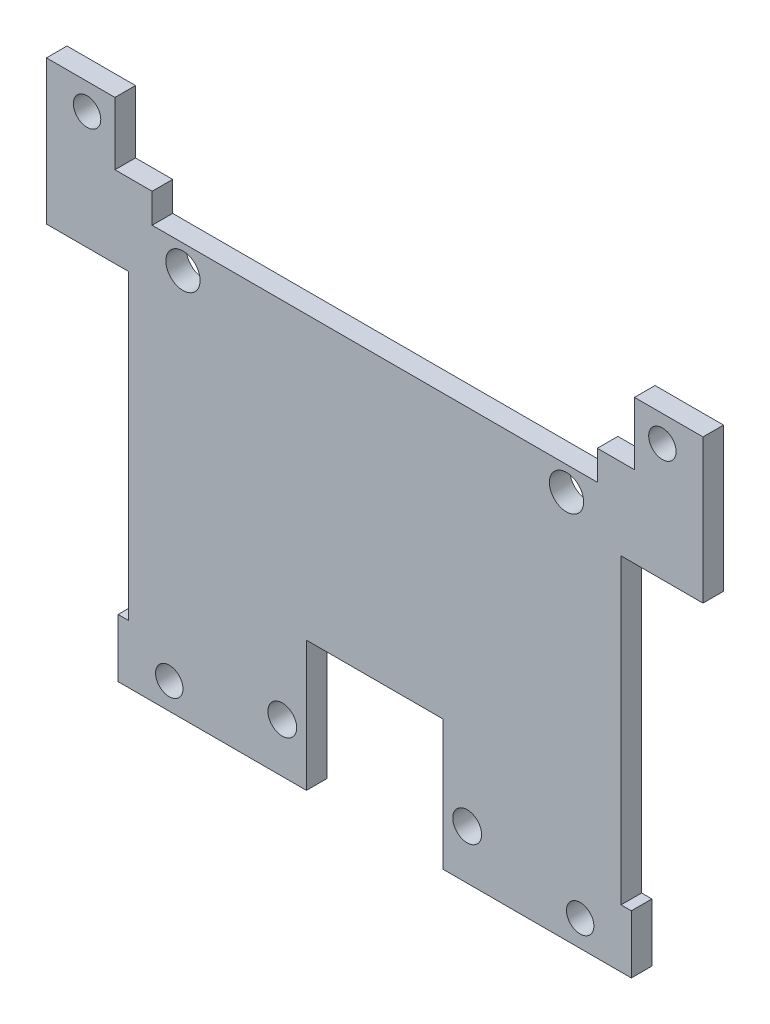
ISO-10303-21;
HEADER;
FILE_DESCRIPTION(('STEP AP214'),'2;1');
FILE_NAME('part.step','',(''),(''),'','','');
FILE_SCHEMA(('AUTOMOTIVE_DESIGN { 1 0 10303 214 1 1 1 1 }'));
ENDSEC;
DATA;
#1=APPLICATION_CONTEXT('core data for automotive mechanical design processes');
#2=APPLICATION_PROTOCOL_DEFINITION('international standard','automotive_design',2000,#1);
#3=PRODUCT_CONTEXT('',#1,'mechanical');
#4=PRODUCT('Part','Part','',(#3));
#5=PRODUCT_RELATED_PRODUCT_CATEGORY('part','',(#4));
#6=PRODUCT_DEFINITION_FORMATION('','',#4);
#7=PRODUCT_DEFINITION_CONTEXT('part definition',#1,'design');
#8=PRODUCT_DEFINITION('design','',#6,#7);
#9=PRODUCT_DEFINITION_SHAPE('','',#8);
#10=(LENGTH_UNIT() NAMED_UNIT(*) SI_UNIT(.MILLI.,.METRE.));
#11=(NAMED_UNIT(*) PLANE_ANGLE_UNIT() SI_UNIT($,.RADIAN.));
#12=(NAMED_UNIT(*) SI_UNIT($,.STERADIAN.) SOLID_ANGLE_UNIT());
#13=UNCERTAINTY_MEASURE_WITH_UNIT(LENGTH_MEASURE(1.E-05),#10,'distance_accuracy_value','');
#14=(GEOMETRIC_REPRESENTATION_CONTEXT(3) GLOBAL_UNCERTAINTY_ASSIGNED_CONTEXT((#13)) GLOBAL_UNIT_ASSIGNED_CONTEXT((#10,
#11,#12)) REPRESENTATION_CONTEXT('',''));
#15=CARTESIAN_POINT('',(0.,0.,0.));
#16=DIRECTION('',(0.,0.,1.));
#17=DIRECTION('',(1.,0.,0.));
#18=AXIS2_PLACEMENT_3D('',#15,#16,#17);
#19=CARTESIAN_POINT('',(-32.5,23.375,3.));
#20=DIRECTION('',(-1.,0.,0.));
#21=DIRECTION('',(0.,0.,1.));
#22=AXIS2_PLACEMENT_3D('',#19,#20,#21);
#23=PLANE('',#22);
#24=DIRECTION('',(0.,1.,0.));
#25=VECTOR('',#24,1.);
#26=CARTESIAN_POINT('',(-32.5,23.375,0.));
#27=LINE('',#26,#25);
#28=CARTESIAN_POINT('',(-32.5,23.375,0.));
#29=VERTEX_POINT('',#28);
#30=CARTESIAN_POINT('',(-32.5,27.675,0.));
#31=VERTEX_POINT('',#30);
#32=EDGE_CURVE('E229',#29,#31,#27,.T.);
#33=ORIENTED_EDGE('',*,*,#32,.T.);
#34=DIRECTION('',(0.,0.,-1.));
#35=VECTOR('',#34,1.);
#36=CARTESIAN_POINT('',(-32.5,27.675,3.));
#37=LINE('',#36,#35);
#38=CARTESIAN_POINT('',(-32.5,27.675,3.));
#39=VERTEX_POINT('',#38);
#40=EDGE_CURVE('E11',#39,#31,#37,.T.);
#41=ORIENTED_EDGE('',*,*,#40,.F.);
#42=DIRECTION('',(0.,1.,0.));
#43=VECTOR('',#42,1.);
#44=CARTESIAN_POINT('',(-32.5,23.375,3.));
#45=LINE('',#44,#43);
#46=CARTESIAN_POINT('',(-32.5,23.375,3.));
#47=VERTEX_POINT('',#46);
#48=EDGE_CURVE('E276',#47,#39,#45,.T.);
#49=ORIENTED_EDGE('',*,*,#48,.F.);
#50=DIRECTION('',(0.,0.,-1.));
#51=VECTOR('',#50,1.);
#52=CARTESIAN_POINT('',(-32.5,23.375,3.));
#53=LINE('',#52,#51);
#54=EDGE_CURVE('E225',#47,#29,#53,.T.);
#55=ORIENTED_EDGE('',*,*,#54,.T.);
#56=EDGE_LOOP('',(#33,#41,#49,#55));
#57=FACE_BOUND('',#56,.T.);
#58=ADVANCED_FACE('F35',(#57),#23,.F.);
#59=CARTESIAN_POINT('',(-32.5,27.675,3.));
#60=DIRECTION('',(0.,-1.,0.));
#61=DIRECTION('',(0.,0.,-1.));
#62=AXIS2_PLACEMENT_3D('',#59,#60,#61);
#63=PLANE('',#62);
#64=DIRECTION('',(-1.,0.,0.));
#65=VECTOR('',#64,1.);
#66=CARTESIAN_POINT('',(-32.5,27.675,0.));
#67=LINE('',#66,#65);
#68=CARTESIAN_POINT('',(-37.93,27.675,0.));
#69=VERTEX_POINT('',#68);
#70=EDGE_CURVE('E232',#31,#69,#67,.T.);
#71=ORIENTED_EDGE('',*,*,#70,.T.);
#72=DIRECTION('',(0.,0.,-1.));
#73=VECTOR('',#72,1.);
#74=CARTESIAN_POINT('',(-37.93,27.675,3.));
#75=LINE('',#74,#73);
#76=CARTESIAN_POINT('',(-37.93,27.675,3.));
#77=VERTEX_POINT('',#76);
#78=EDGE_CURVE('E44',#77,#69,#75,.T.);
#79=ORIENTED_EDGE('',*,*,#78,.F.);
#80=DIRECTION('',(-1.,0.,0.));
#81=VECTOR('',#80,1.);
#82=CARTESIAN_POINT('',(-32.5,27.675,3.));
#83=LINE('',#82,#81);
#84=EDGE_CURVE('E144',#39,#77,#83,.T.);
#85=ORIENTED_EDGE('',*,*,#84,.F.);
#86=ORIENTED_EDGE('',*,*,#40,.T.);
#87=EDGE_LOOP('',(#71,#79,#85,#86));
#88=FACE_BOUND('',#87,.T.);
#89=ADVANCED_FACE('F447',(#88),#63,.F.);
#90=CARTESIAN_POINT('',(-37.93,27.675,3.));
#91=DIRECTION('',(-1.,0.,0.));
#92=DIRECTION('',(0.,0.,1.));
#93=AXIS2_PLACEMENT_3D('',#90,#91,#92);
#94=PLANE('',#93);
#95=DIRECTION('',(0.,1.,0.));
#96=VECTOR('',#95,1.);
#97=CARTESIAN_POINT('',(-37.93,27.675,0.));
#98=LINE('',#97,#96);
#99=CARTESIAN_POINT('',(-37.93,36.825,0.));
#100=VERTEX_POINT('',#99);
#101=EDGE_CURVE('E235',#69,#100,#98,.T.);
#102=ORIENTED_EDGE('',*,*,#101,.T.);
#103=DIRECTION('',(0.,0.,-1.));
#104=VECTOR('',#103,1.);
#105=CARTESIAN_POINT('',(-37.93,36.825,3.));
#106=LINE('',#105,#104);
#107=CARTESIAN_POINT('',(-37.93,36.825,3.));
#108=VERTEX_POINT('',#107);
#109=EDGE_CURVE('E331',#108,#100,#106,.T.);
#110=ORIENTED_EDGE('',*,*,#109,.F.);
#111=DIRECTION('',(0.,1.,0.));
#112=VECTOR('',#111,1.);
#113=CARTESIAN_POINT('',(-37.93,27.675,3.));
#114=LINE('',#113,#112);
#115=EDGE_CURVE('E383',#77,#108,#114,.T.);
#116=ORIENTED_EDGE('',*,*,#115,.F.);
#117=ORIENTED_EDGE('',*,*,#78,.T.);
#118=EDGE_LOOP('',(#102,#110,#116,#117));
#119=FACE_BOUND('',#118,.T.);
#120=ADVANCED_FACE('F451',(#119),#94,.F.);
#121=CARTESIAN_POINT('',(-37.93,36.825,3.));
#122=DIRECTION('',(0.,-1.,0.));
#123=DIRECTION('',(0.,0.,-1.));
#124=AXIS2_PLACEMENT_3D('',#121,#122,#123);
#125=PLANE('',#124);
#126=DIRECTION('',(-1.,0.,0.));
#127=VECTOR('',#126,1.);
#128=CARTESIAN_POINT('',(-37.93,36.825,0.));
#129=LINE('',#128,#127);
#130=CARTESIAN_POINT('',(-47.93,36.825,0.));
#131=VERTEX_POINT('',#130);
#132=EDGE_CURVE('E237',#100,#131,#129,.T.);
#133=ORIENTED_EDGE('',*,*,#132,.T.);
#134=DIRECTION('',(0.,0.,-1.));
#135=VECTOR('',#134,1.);
#136=CARTESIAN_POINT('',(-47.93,36.825,3.));
#137=LINE('',#136,#135);
#138=CARTESIAN_POINT('',(-47.93,36.825,3.));
#139=VERTEX_POINT('',#138);
#140=EDGE_CURVE('E328',#139,#131,#137,.T.);
#141=ORIENTED_EDGE('',*,*,#140,.F.);
#142=DIRECTION('',(-1.,0.,0.));
#143=VECTOR('',#142,1.);
#144=CARTESIAN_POINT('',(-37.93,36.825,3.));
#145=LINE('',#144,#143);
#146=EDGE_CURVE('E385',#108,#139,#145,.T.);
#147=ORIENTED_EDGE('',*,*,#146,.F.);
#148=ORIENTED_EDGE('',*,*,#109,.T.);
#149=EDGE_LOOP('',(#133,#141,#147,#148));
#150=FACE_BOUND('',#149,.T.);
#151=ADVANCED_FACE('F455',(#150),#125,.F.);
#152=CARTESIAN_POINT('',(-47.93,36.825,3.));
#153=DIRECTION('',(1.,0.,0.));
#154=DIRECTION('',(0.,1.,0.));
#155=AXIS2_PLACEMENT_3D('',#152,#153,#154);
#156=PLANE('',#155);
#157=DIRECTION('',(0.,-1.,0.));
#158=VECTOR('',#157,1.);
#159=CARTESIAN_POINT('',(-47.93,36.825,0.));
#160=LINE('',#159,#158);
#161=CARTESIAN_POINT('',(-47.93,15.805,0.));
#162=VERTEX_POINT('',#161);
#163=EDGE_CURVE('E239',#131,#162,#160,.T.);
#164=ORIENTED_EDGE('',*,*,#163,.T.);
#165=DIRECTION('',(0.,0.,-1.));
#166=VECTOR('',#165,1.);
#167=CARTESIAN_POINT('',(-47.93,15.805,3.));
#168=LINE('',#167,#166);
#169=CARTESIAN_POINT('',(-47.93,15.805,3.));
#170=VERTEX_POINT('',#169);
#171=EDGE_CURVE('E325',#170,#162,#168,.T.);
#172=ORIENTED_EDGE('',*,*,#171,.F.);
#173=DIRECTION('',(0.,-1.,0.));
#174=VECTOR('',#173,1.);
#175=CARTESIAN_POINT('',(-47.93,36.825,3.));
#176=LINE('',#175,#174);
#177=EDGE_CURVE('E387',#139,#170,#176,.T.);
#178=ORIENTED_EDGE('',*,*,#177,.F.);
#179=ORIENTED_EDGE('',*,*,#140,.T.);
#180=EDGE_LOOP('',(#164,#172,#178,#179));
#181=FACE_BOUND('',#180,.T.);
#182=ADVANCED_FACE('F461',(#181),#156,.F.);
#183=CARTESIAN_POINT('',(-47.93,15.805,3.));
#184=DIRECTION('',(0.,1.,0.));
#185=DIRECTION('',(-1.,0.,0.));
#186=AXIS2_PLACEMENT_3D('',#183,#184,#185);
#187=PLANE('',#186);
#188=DIRECTION('',(1.,0.,0.));
#189=VECTOR('',#188,1.);
#190=CARTESIAN_POINT('',(-47.93,15.805,0.));
#191=LINE('',#190,#189);
#192=CARTESIAN_POINT('',(-35.97,15.805,0.));
#193=VERTEX_POINT('',#192);
#194=EDGE_CURVE('E241',#162,#193,#191,.T.);
#195=ORIENTED_EDGE('',*,*,#194,.T.);
#196=DIRECTION('',(0.,0.,-1.));
#197=VECTOR('',#196,1.);
#198=CARTESIAN_POINT('',(-35.97,15.805,3.));
#199=LINE('',#198,#197);
#200=CARTESIAN_POINT('',(-35.97,15.805,3.));
#201=VERTEX_POINT('',#200);
#202=EDGE_CURVE('E322',#201,#193,#199,.T.);
#203=ORIENTED_EDGE('',*,*,#202,.F.);
#204=DIRECTION('',(1.,0.,0.));
#205=VECTOR('',#204,1.);
#206=CARTESIAN_POINT('',(-47.93,15.805,3.));
#207=LINE('',#206,#205);
#208=EDGE_CURVE('E389',#170,#201,#207,.T.);
#209=ORIENTED_EDGE('',*,*,#208,.F.);
#210=ORIENTED_EDGE('',*,*,#171,.T.);
#211=EDGE_LOOP('',(#195,#203,#209,#210));
#212=FACE_BOUND('',#211,.T.);
#213=ADVANCED_FACE('F465',(#212),#187,.F.);
#214=CARTESIAN_POINT('',(-35.97,15.805,3.));
#215=DIRECTION('',(1.,0.,0.));
#216=DIRECTION('',(0.,1.,0.));
#217=AXIS2_PLACEMENT_3D('',#214,#215,#216);
#218=PLANE('',#217);
#219=DIRECTION('',(0.,-1.,0.));
#220=VECTOR('',#219,1.);
#221=CARTESIAN_POINT('',(-35.97,15.805,0.));
#222=LINE('',#221,#220);
#223=CARTESIAN_POINT('',(-35.97,-28.325,0.));
#224=VERTEX_POINT('',#223);
#225=EDGE_CURVE('E243',#193,#224,#222,.T.);
#226=ORIENTED_EDGE('',*,*,#225,.T.);
#227=DIRECTION('',(0.,0.,-1.));
#228=VECTOR('',#227,1.);
#229=CARTESIAN_POINT('',(-35.97,-28.325,3.));
#230=LINE('',#229,#228);
#231=CARTESIAN_POINT('',(-35.97,-28.325,3.));
#232=VERTEX_POINT('',#231);
#233=EDGE_CURVE('E319',#232,#224,#230,.T.);
#234=ORIENTED_EDGE('',*,*,#233,.F.);
#235=DIRECTION('',(0.,-1.,0.));
#236=VECTOR('',#235,1.);
#237=CARTESIAN_POINT('',(-35.97,15.805,3.));
#238=LINE('',#237,#236);
#239=EDGE_CURVE('E391',#201,#232,#238,.T.);
#240=ORIENTED_EDGE('',*,*,#239,.F.);
#241=ORIENTED_EDGE('',*,*,#202,.T.);
#242=EDGE_LOOP('',(#226,#234,#240,#241));
#243=FACE_BOUND('',#242,.T.);
#244=ADVANCED_FACE('F469',(#243),#218,.F.);
#245=CARTESIAN_POINT('',(-35.97,-28.325,3.));
#246=DIRECTION('',(0.,-1.,0.));
#247=DIRECTION('',(1.,0.,0.));
#248=AXIS2_PLACEMENT_3D('',#245,#246,#247);
#249=PLANE('',#248);
#250=DIRECTION('',(-1.,0.,0.));
#251=VECTOR('',#250,1.);
#252=CARTESIAN_POINT('',(-35.97,-28.325,0.));
#253=LINE('',#252,#251);
#254=CARTESIAN_POINT('',(-37.47,-28.325,0.));
#255=VERTEX_POINT('',#254);
#256=EDGE_CURVE('E245',#224,#255,#253,.T.);
#257=ORIENTED_EDGE('',*,*,#256,.T.);
#258=DIRECTION('',(0.,0.,-1.));
#259=VECTOR('',#258,1.);
#260=CARTESIAN_POINT('',(-37.47,-28.325,3.));
#261=LINE('',#260,#259);
#262=CARTESIAN_POINT('',(-37.47,-28.325,3.));
#263=VERTEX_POINT('',#262);
#264=EDGE_CURVE('E316',#263,#255,#261,.T.);
#265=ORIENTED_EDGE('',*,*,#264,.F.);
#266=DIRECTION('',(-1.,0.,0.));
#267=VECTOR('',#266,1.);
#268=CARTESIAN_POINT('',(-35.97,-28.325,3.));
#269=LINE('',#268,#267);
#270=EDGE_CURVE('E393',#232,#263,#269,.T.);
#271=ORIENTED_EDGE('',*,*,#270,.F.);
#272=ORIENTED_EDGE('',*,*,#233,.T.);
#273=EDGE_LOOP('',(#257,#265,#271,#272));
#274=FACE_BOUND('',#273,.T.);
#275=ADVANCED_FACE('F473',(#274),#249,.F.);
#276=CARTESIAN_POINT('',(-37.47,-28.325,3.));
#277=DIRECTION('',(1.,0.,0.));
#278=DIRECTION('',(0.,0.,-1.));
#279=AXIS2_PLACEMENT_3D('',#276,#277,#278);
#280=PLANE('',#279);
#281=DIRECTION('',(0.,-1.,0.));
#282=VECTOR('',#281,1.);
#283=CARTESIAN_POINT('',(-37.47,-28.325,0.));
#284=LINE('',#283,#282);
#285=CARTESIAN_POINT('',(-37.47,-36.825,0.));
#286=VERTEX_POINT('',#285);
#287=EDGE_CURVE('E247',#255,#286,#284,.T.);
#288=ORIENTED_EDGE('',*,*,#287,.T.);
#289=DIRECTION('',(0.,0.,-1.));
#290=VECTOR('',#289,1.);
#291=CARTESIAN_POINT('',(-37.47,-36.825,3.));
#292=LINE('',#291,#290);
#293=CARTESIAN_POINT('',(-37.47,-36.825,3.));
#294=VERTEX_POINT('',#293);
#295=EDGE_CURVE('E313',#294,#286,#292,.T.);
#296=ORIENTED_EDGE('',*,*,#295,.F.);
#297=DIRECTION('',(0.,-1.,0.));
#298=VECTOR('',#297,1.);
#299=CARTESIAN_POINT('',(-37.47,-28.325,3.));
#300=LINE('',#299,#298);
#301=EDGE_CURVE('E395',#263,#294,#300,.T.);
#302=ORIENTED_EDGE('',*,*,#301,.F.);
#303=ORIENTED_EDGE('',*,*,#264,.T.);
#304=EDGE_LOOP('',(#288,#296,#302,#303));
#305=FACE_BOUND('',#304,.T.);
#306=ADVANCED_FACE('F477',(#305),#280,.F.);
#307=CARTESIAN_POINT('',(-37.47,-36.825,3.));
#308=DIRECTION('',(0.,1.,0.));
#309=DIRECTION('',(-1.,0.,0.));
#310=AXIS2_PLACEMENT_3D('',#307,#308,#309);
#311=PLANE('',#310);
#312=DIRECTION('',(1.,0.,0.));
#313=VECTOR('',#312,1.);
#314=CARTESIAN_POINT('',(-37.47,-36.825,0.));
#315=LINE('',#314,#313);
#316=CARTESIAN_POINT('',(-9.97,-36.825,0.));
#317=VERTEX_POINT('',#316);
#318=EDGE_CURVE('E249',#286,#317,#315,.T.);
#319=ORIENTED_EDGE('',*,*,#318,.T.);
#320=DIRECTION('',(0.,0.,-1.));
#321=VECTOR('',#320,1.);
#322=CARTESIAN_POINT('',(-9.97,-36.825,3.));
#323=LINE('',#322,#321);
#324=CARTESIAN_POINT('',(-9.97,-36.825,3.));
#325=VERTEX_POINT('',#324);
#326=EDGE_CURVE('E310',#325,#317,#323,.T.);
#327=ORIENTED_EDGE('',*,*,#326,.F.);
#328=DIRECTION('',(1.,0.,0.));
#329=VECTOR('',#328,1.);
#330=CARTESIAN_POINT('',(-37.47,-36.825,3.));
#331=LINE('',#330,#329);
#332=EDGE_CURVE('E397',#294,#325,#331,.T.);
#333=ORIENTED_EDGE('',*,*,#332,.F.);
#334=ORIENTED_EDGE('',*,*,#295,.T.);
#335=EDGE_LOOP('',(#319,#327,#333,#334));
#336=FACE_BOUND('',#335,.T.);
#337=ADVANCED_FACE('F481',(#336),#311,.F.);
#338=CARTESIAN_POINT('',(-9.97,-36.825,3.));
#339=DIRECTION('',(-1.,0.,0.));
#340=DIRECTION('',(0.,0.,1.));
#341=AXIS2_PLACEMENT_3D('',#338,#339,#340);
#342=PLANE('',#341);
#343=DIRECTION('',(0.,1.,0.));
#344=VECTOR('',#343,1.);
#345=CARTESIAN_POINT('',(-9.97,-36.825,0.));
#346=LINE('',#345,#344);
#347=CARTESIAN_POINT('',(-9.97,-17.825,0.));
#348=VERTEX_POINT('',#347);
#349=EDGE_CURVE('E251',#317,#348,#346,.T.);
#350=ORIENTED_EDGE('',*,*,#349,.T.);
#351=DIRECTION('',(0.,0.,-1.));
#352=VECTOR('',#351,1.);
#353=CARTESIAN_POINT('',(-9.97,-17.825,3.));
#354=LINE('',#353,#352);
#355=CARTESIAN_POINT('',(-9.97,-17.825,3.));
#356=VERTEX_POINT('',#355);
#357=EDGE_CURVE('E307',#356,#348,#354,.T.);
#358=ORIENTED_EDGE('',*,*,#357,.F.);
#359=DIRECTION('',(0.,1.,0.));
#360=VECTOR('',#359,1.);
#361=CARTESIAN_POINT('',(-9.97,-36.825,3.));
#362=LINE('',#361,#360);
#363=EDGE_CURVE('E399',#325,#356,#362,.T.);
#364=ORIENTED_EDGE('',*,*,#363,.F.);
#365=ORIENTED_EDGE('',*,*,#326,.T.);
#366=EDGE_LOOP('',(#350,#358,#364,#365));
#367=FACE_BOUND('',#366,.T.);
#368=ADVANCED_FACE('F485',(#367),#342,.F.);
#369=CARTESIAN_POINT('',(-9.97,-17.825,3.));
#370=DIRECTION('',(0.,1.,0.));
#371=DIRECTION('',(-1.,0.,0.));
#372=AXIS2_PLACEMENT_3D('',#369,#370,#371);
#373=PLANE('',#372);
#374=DIRECTION('',(1.,0.,0.));
#375=VECTOR('',#374,1.);
#376=CARTESIAN_POINT('',(-9.97,-17.825,0.));
#377=LINE('',#376,#375);
#378=CARTESIAN_POINT('',(9.97,-17.825,0.));
#379=VERTEX_POINT('',#378);
#380=EDGE_CURVE('E253',#348,#379,#377,.T.);
#381=ORIENTED_EDGE('',*,*,#380,.T.);
#382=DIRECTION('',(0.,0.,-1.));
#383=VECTOR('',#382,1.);
#384=CARTESIAN_POINT('',(9.97,-17.825,3.));
#385=LINE('',#384,#383);
#386=CARTESIAN_POINT('',(9.97,-17.825,3.));
#387=VERTEX_POINT('',#386);
#388=EDGE_CURVE('E304',#387,#379,#385,.T.);
#389=ORIENTED_EDGE('',*,*,#388,.F.);
#390=DIRECTION('',(1.,0.,0.));
#391=VECTOR('',#390,1.);
#392=CARTESIAN_POINT('',(-9.97,-17.825,3.));
#393=LINE('',#392,#391);
#394=EDGE_CURVE('E401',#356,#387,#393,.T.);
#395=ORIENTED_EDGE('',*,*,#394,.F.);
#396=ORIENTED_EDGE('',*,*,#357,.T.);
#397=EDGE_LOOP('',(#381,#389,#395,#396));
#398=FACE_BOUND('',#397,.T.);
#399=ADVANCED_FACE('F489',(#398),#373,.F.);
#400=CARTESIAN_POINT('',(9.97000000000001,-36.825,3.));
#401=DIRECTION('',(1.,0.,0.));
#402=DIRECTION('',(0.,1.,0.));
#403=AXIS2_PLACEMENT_3D('',#400,#401,#402);
#404=PLANE('',#403);
#405=DIRECTION('',(0.,-1.,0.));
#406=VECTOR('',#405,1.);
#407=CARTESIAN_POINT('',(9.97000000000001,-36.825,0.));
#408=LINE('',#407,#406);
#409=CARTESIAN_POINT('',(9.97000000000001,-36.825,0.));
#410=VERTEX_POINT('',#409);
#411=EDGE_CURVE('E255',#379,#410,#408,.T.);
#412=ORIENTED_EDGE('',*,*,#411,.T.);
#413=DIRECTION('',(0.,0.,-1.));
#414=VECTOR('',#413,1.);
#415=CARTESIAN_POINT('',(9.97000000000001,-36.825,3.));
#416=LINE('',#415,#414);
#417=CARTESIAN_POINT('',(9.97000000000001,-36.825,3.));
#418=VERTEX_POINT('',#417);
#419=EDGE_CURVE('E301',#418,#410,#416,.T.);
#420=ORIENTED_EDGE('',*,*,#419,.F.);
#421=DIRECTION('',(0.,-1.,0.));
#422=VECTOR('',#421,1.);
#423=CARTESIAN_POINT('',(9.97000000000001,-36.825,3.));
#424=LINE('',#423,#422);
#425=EDGE_CURVE('E403',#387,#418,#424,.T.);
#426=ORIENTED_EDGE('',*,*,#425,.F.);
#427=ORIENTED_EDGE('',*,*,#388,.T.);
#428=EDGE_LOOP('',(#412,#420,#426,#427));
#429=FACE_BOUND('',#428,.T.);
#430=ADVANCED_FACE('F493',(#429),#404,.F.);
#431=CARTESIAN_POINT('',(37.47,-36.825,3.));
#432=DIRECTION('',(0.,1.,0.));
#433=DIRECTION('',(0.,0.,1.));
#434=AXIS2_PLACEMENT_3D('',#431,#432,#433);
#435=PLANE('',#434);
#436=DIRECTION('',(1.,0.,0.));
#437=VECTOR('',#436,1.);
#438=CARTESIAN_POINT('',(37.47,-36.825,0.));
#439=LINE('',#438,#437);
#440=CARTESIAN_POINT('',(37.47,-36.825,0.));
#441=VERTEX_POINT('',#440);
#442=EDGE_CURVE('E257',#410,#441,#439,.T.);
#443=ORIENTED_EDGE('',*,*,#442,.T.);
#444=DIRECTION('',(0.,0.,-1.));
#445=VECTOR('',#444,1.);
#446=CARTESIAN_POINT('',(37.47,-36.825,3.));
#447=LINE('',#446,#445);
#448=CARTESIAN_POINT('',(37.47,-36.825,3.));
#449=VERTEX_POINT('',#448);
#450=EDGE_CURVE('E298',#449,#441,#447,.T.);
#451=ORIENTED_EDGE('',*,*,#450,.F.);
#452=DIRECTION('',(1.,0.,0.));
#453=VECTOR('',#452,1.);
#454=CARTESIAN_POINT('',(37.47,-36.825,3.));
#455=LINE('',#454,#453);
#456=EDGE_CURVE('E405',#418,#449,#455,.T.);
#457=ORIENTED_EDGE('',*,*,#456,.F.);
#458=ORIENTED_EDGE('',*,*,#419,.T.);
#459=EDGE_LOOP('',(#443,#451,#457,#458));
#460=FACE_BOUND('',#459,.T.);
#461=ADVANCED_FACE('F497',(#460),#435,.F.);
#462=CARTESIAN_POINT('',(37.47,-28.325,3.));
#463=DIRECTION('',(-1.,0.,0.));
#464=DIRECTION('',(0.,-1.,0.));
#465=AXIS2_PLACEMENT_3D('',#462,#463,#464);
#466=PLANE('',#465);
#467=DIRECTION('',(0.,1.,0.));
#468=VECTOR('',#467,1.);
#469=CARTESIAN_POINT('',(37.47,-28.325,0.));
#470=LINE('',#469,#468);
#471=CARTESIAN_POINT('',(37.47,-28.325,0.));
#472=VERTEX_POINT('',#471);
#473=EDGE_CURVE('E259',#441,#472,#470,.T.);
#474=ORIENTED_EDGE('',*,*,#473,.T.);
#475=DIRECTION('',(0.,0.,-1.));
#476=VECTOR('',#475,1.);
#477=CARTESIAN_POINT('',(37.47,-28.325,3.));
#478=LINE('',#477,#476);
#479=CARTESIAN_POINT('',(37.47,-28.325,3.));
#480=VERTEX_POINT('',#479);
#481=EDGE_CURVE('E295',#480,#472,#478,.T.);
#482=ORIENTED_EDGE('',*,*,#481,.F.);
#483=DIRECTION('',(0.,1.,0.));
#484=VECTOR('',#483,1.);
#485=CARTESIAN_POINT('',(37.47,-28.325,3.));
#486=LINE('',#485,#484);
#487=EDGE_CURVE('E407',#449,#480,#486,.T.);
#488=ORIENTED_EDGE('',*,*,#487,.F.);
#489=ORIENTED_EDGE('',*,*,#450,.T.);
#490=EDGE_LOOP('',(#474,#482,#488,#489));
#491=FACE_BOUND('',#490,.T.);
#492=ADVANCED_FACE('F501',(#491),#466,.F.);
#493=CARTESIAN_POINT('',(35.97,-28.325,3.));
#494=DIRECTION('',(0.,-1.,0.));
#495=DIRECTION('',(1.,0.,0.));
#496=AXIS2_PLACEMENT_3D('',#493,#494,#495);
#497=PLANE('',#496);
#498=DIRECTION('',(-1.,0.,0.));
#499=VECTOR('',#498,1.);
#500=CARTESIAN_POINT('',(35.97,-28.325,0.));
#501=LINE('',#500,#499);
#502=CARTESIAN_POINT('',(35.97,-28.325,0.));
#503=VERTEX_POINT('',#502);
#504=EDGE_CURVE('E261',#472,#503,#501,.T.);
#505=ORIENTED_EDGE('',*,*,#504,.T.);
#506=DIRECTION('',(0.,0.,-1.));
#507=VECTOR('',#506,1.);
#508=CARTESIAN_POINT('',(35.97,-28.325,3.));
#509=LINE('',#508,#507);
#510=CARTESIAN_POINT('',(35.97,-28.325,3.));
#511=VERTEX_POINT('',#510);
#512=EDGE_CURVE('E292',#511,#503,#509,.T.);
#513=ORIENTED_EDGE('',*,*,#512,.F.);
#514=DIRECTION('',(-1.,0.,0.));
#515=VECTOR('',#514,1.);
#516=CARTESIAN_POINT('',(35.97,-28.325,3.));
#517=LINE('',#516,#515);
#518=EDGE_CURVE('E409',#480,#511,#517,.T.);
#519=ORIENTED_EDGE('',*,*,#518,.F.);
#520=ORIENTED_EDGE('',*,*,#481,.T.);
#521=EDGE_LOOP('',(#505,#513,#519,#520));
#522=FACE_BOUND('',#521,.T.);
#523=ADVANCED_FACE('F505',(#522),#497,.F.);
#524=CARTESIAN_POINT('',(35.97,15.805,3.));
#525=DIRECTION('',(-1.,0.,0.));
#526=DIRECTION('',(0.,-1.,0.));
#527=AXIS2_PLACEMENT_3D('',#524,#525,#526);
#528=PLANE('',#527);
#529=DIRECTION('',(0.,1.,0.));
#530=VECTOR('',#529,1.);
#531=CARTESIAN_POINT('',(35.97,15.805,0.));
#532=LINE('',#531,#530);
#533=CARTESIAN_POINT('',(35.97,15.805,0.));
#534=VERTEX_POINT('',#533);
#535=EDGE_CURVE('E263',#503,#534,#532,.T.);
#536=ORIENTED_EDGE('',*,*,#535,.T.);
#537=DIRECTION('',(0.,0.,-1.));
#538=VECTOR('',#537,1.);
#539=CARTESIAN_POINT('',(35.97,15.805,3.));
#540=LINE('',#539,#538);
#541=CARTESIAN_POINT('',(35.97,15.805,3.));
#542=VERTEX_POINT('',#541);
#543=EDGE_CURVE('E289',#542,#534,#540,.T.);
#544=ORIENTED_EDGE('',*,*,#543,.F.);
#545=DIRECTION('',(0.,1.,0.));
#546=VECTOR('',#545,1.);
#547=CARTESIAN_POINT('',(35.97,15.805,3.));
#548=LINE('',#547,#546);
#549=EDGE_CURVE('E411',#511,#542,#548,.T.);
#550=ORIENTED_EDGE('',*,*,#549,.F.);
#551=ORIENTED_EDGE('',*,*,#512,.T.);
#552=EDGE_LOOP('',(#536,#544,#550,#551));
#553=FACE_BOUND('',#552,.T.);
#554=ADVANCED_FACE('F509',(#553),#528,.F.);
#555=CARTESIAN_POINT('',(47.93,15.805,3.));
#556=DIRECTION('',(0.,1.,0.));
#557=DIRECTION('',(-1.,0.,0.));
#558=AXIS2_PLACEMENT_3D('',#555,#556,#557);
#559=PLANE('',#558);
#560=DIRECTION('',(1.,0.,0.));
#561=VECTOR('',#560,1.);
#562=CARTESIAN_POINT('',(47.93,15.805,0.));
#563=LINE('',#562,#561);
#564=CARTESIAN_POINT('',(47.93,15.805,0.));
#565=VERTEX_POINT('',#564);
#566=EDGE_CURVE('E265',#534,#565,#563,.T.);
#567=ORIENTED_EDGE('',*,*,#566,.T.);
#568=DIRECTION('',(0.,0.,-1.));
#569=VECTOR('',#568,1.);
#570=CARTESIAN_POINT('',(47.93,15.805,3.));
#571=LINE('',#570,#569);
#572=CARTESIAN_POINT('',(47.93,15.805,3.));
#573=VERTEX_POINT('',#572);
#574=EDGE_CURVE('E286',#573,#565,#571,.T.);
#575=ORIENTED_EDGE('',*,*,#574,.F.);
#576=DIRECTION('',(1.,0.,0.));
#577=VECTOR('',#576,1.);
#578=CARTESIAN_POINT('',(47.93,15.805,3.));
#579=LINE('',#578,#577);
#580=EDGE_CURVE('E413',#542,#573,#579,.T.);
#581=ORIENTED_EDGE('',*,*,#580,.F.);
#582=ORIENTED_EDGE('',*,*,#543,.T.);
#583=EDGE_LOOP('',(#567,#575,#581,#582));
#584=FACE_BOUND('',#583,.T.);
#585=ADVANCED_FACE('F513',(#584),#559,.F.);
#586=CARTESIAN_POINT('',(47.93,36.825,3.));
#587=DIRECTION('',(-1.,0.,0.));
#588=DIRECTION('',(0.,-1.,0.));
#589=AXIS2_PLACEMENT_3D('',#586,#587,#588);
#590=PLANE('',#589);
#591=DIRECTION('',(0.,1.,0.));
#592=VECTOR('',#591,1.);
#593=CARTESIAN_POINT('',(47.93,36.825,0.));
#594=LINE('',#593,#592);
#595=CARTESIAN_POINT('',(47.93,36.825,0.));
#596=VERTEX_POINT('',#595);
#597=EDGE_CURVE('E267',#565,#596,#594,.T.);
#598=ORIENTED_EDGE('',*,*,#597,.T.);
#599=DIRECTION('',(0.,0.,-1.));
#600=VECTOR('',#599,1.);
#601=CARTESIAN_POINT('',(47.93,36.825,3.));
#602=LINE('',#601,#600);
#603=CARTESIAN_POINT('',(47.93,36.825,3.));
#604=VERTEX_POINT('',#603);
#605=EDGE_CURVE('E283',#604,#596,#602,.T.);
#606=ORIENTED_EDGE('',*,*,#605,.F.);
#607=DIRECTION('',(0.,1.,0.));
#608=VECTOR('',#607,1.);
#609=CARTESIAN_POINT('',(47.93,36.825,3.));
#610=LINE('',#609,#608);
#611=EDGE_CURVE('E415',#573,#604,#610,.T.);
#612=ORIENTED_EDGE('',*,*,#611,.F.);
#613=ORIENTED_EDGE('',*,*,#574,.T.);
#614=EDGE_LOOP('',(#598,#606,#612,#613));
#615=FACE_BOUND('',#614,.T.);
#616=ADVANCED_FACE('F517',(#615),#590,.F.);
#617=CARTESIAN_POINT('',(37.93,36.825,3.));
#618=DIRECTION('',(0.,-1.,0.));
#619=DIRECTION('',(1.,0.,0.));
#620=AXIS2_PLACEMENT_3D('',#617,#618,#619);
#621=PLANE('',#620);
#622=DIRECTION('',(-1.,0.,0.));
#623=VECTOR('',#622,1.);
#624=CARTESIAN_POINT('',(37.93,36.825,0.));
#625=LINE('',#624,#623);
#626=CARTESIAN_POINT('',(37.93,36.825,0.));
#627=VERTEX_POINT('',#626);
#628=EDGE_CURVE('E269',#596,#627,#625,.T.);
#629=ORIENTED_EDGE('',*,*,#628,.T.);
#630=DIRECTION('',(0.,0.,-1.));
#631=VECTOR('',#630,1.);
#632=CARTESIAN_POINT('',(37.93,36.825,3.));
#633=LINE('',#632,#631);
#634=CARTESIAN_POINT('',(37.93,36.825,3.));
#635=VERTEX_POINT('',#634);
#636=EDGE_CURVE('E280',#635,#627,#633,.T.);
#637=ORIENTED_EDGE('',*,*,#636,.F.);
#638=DIRECTION('',(-1.,0.,0.));
#639=VECTOR('',#638,1.);
#640=CARTESIAN_POINT('',(37.93,36.825,3.));
#641=LINE('',#640,#639);
#642=EDGE_CURVE('E417',#604,#635,#641,.T.);
#643=ORIENTED_EDGE('',*,*,#642,.F.);
#644=ORIENTED_EDGE('',*,*,#605,.T.);
#645=EDGE_LOOP('',(#629,#637,#643,#644));
#646=FACE_BOUND('',#645,.T.);
#647=ADVANCED_FACE('F423',(#646),#621,.F.);
#648=CARTESIAN_POINT('',(37.93,27.675,3.));
#649=DIRECTION('',(1.,0.,0.));
#650=DIRECTION('',(0.,1.,0.));
#651=AXIS2_PLACEMENT_3D('',#648,#649,#650);
#652=PLANE('',#651);
#653=DIRECTION('',(0.,-1.,0.));
#654=VECTOR('',#653,1.);
#655=CARTESIAN_POINT('',(37.93,27.675,0.));
#656=LINE('',#655,#654);
#657=CARTESIAN_POINT('',(37.93,27.675,0.));
#658=VERTEX_POINT('',#657);
#659=EDGE_CURVE('E271',#627,#658,#656,.T.);
#660=ORIENTED_EDGE('',*,*,#659,.T.);
#661=DIRECTION('',(0.,0.,-1.));
#662=VECTOR('',#661,1.);
#663=CARTESIAN_POINT('',(37.93,27.675,3.));
#664=LINE('',#663,#662);
#665=CARTESIAN_POINT('',(37.93,27.675,3.));
#666=VERTEX_POINT('',#665);
#667=EDGE_CURVE('E220',#666,#658,#664,.T.);
#668=ORIENTED_EDGE('',*,*,#667,.F.);
#669=DIRECTION('',(0.,-1.,0.));
#670=VECTOR('',#669,1.);
#671=CARTESIAN_POINT('',(37.93,27.675,3.));
#672=LINE('',#671,#670);
#673=EDGE_CURVE('E211',#635,#666,#672,.T.);
#674=ORIENTED_EDGE('',*,*,#673,.F.);
#675=ORIENTED_EDGE('',*,*,#636,.T.);
#676=EDGE_LOOP('',(#660,#668,#674,#675));
#677=FACE_BOUND('',#676,.T.);
#678=ADVANCED_FACE('F427',(#677),#652,.F.);
#679=CARTESIAN_POINT('',(32.5,27.675,3.));
#680=DIRECTION('',(0.,-1.,0.));
#681=DIRECTION('',(1.,0.,0.));
#682=AXIS2_PLACEMENT_3D('',#679,#680,#681);
#683=PLANE('',#682);
#684=DIRECTION('',(-1.,0.,0.));
#685=VECTOR('',#684,1.);
#686=CARTESIAN_POINT('',(32.5,27.675,0.));
#687=LINE('',#686,#685);
#688=CARTESIAN_POINT('',(32.5,27.675,0.));
#689=VERTEX_POINT('',#688);
#690=EDGE_CURVE('E219',#658,#689,#687,.T.);
#691=ORIENTED_EDGE('',*,*,#690,.T.);
#692=DIRECTION('',(0.,0.,-1.));
#693=VECTOR('',#692,1.);
#694=CARTESIAN_POINT('',(32.5,27.675,3.));
#695=LINE('',#694,#693);
#696=CARTESIAN_POINT('',(32.5,27.675,3.));
#697=VERTEX_POINT('',#696);
#698=EDGE_CURVE('E216',#697,#689,#695,.T.);
#699=ORIENTED_EDGE('',*,*,#698,.F.);
#700=DIRECTION('',(-1.,0.,0.));
#701=VECTOR('',#700,1.);
#702=CARTESIAN_POINT('',(32.5,27.675,3.));
#703=LINE('',#702,#701);
#704=EDGE_CURVE('E205',#666,#697,#703,.T.);
#705=ORIENTED_EDGE('',*,*,#704,.F.);
#706=ORIENTED_EDGE('',*,*,#667,.T.);
#707=EDGE_LOOP('',(#691,#699,#705,#706));
#708=FACE_BOUND('',#707,.T.);
#709=ADVANCED_FACE('F217',(#708),#683,.F.);
#710=CARTESIAN_POINT('',(32.5,23.375,3.));
#711=DIRECTION('',(1.,0.,0.));
#712=DIRECTION('',(0.,0.,-1.));
#713=AXIS2_PLACEMENT_3D('',#710,#711,#712);
#714=PLANE('',#713);
#715=DIRECTION('',(0.,-1.,0.));
#716=VECTOR('',#715,1.);
#717=CARTESIAN_POINT('',(32.5,23.375,0.));
#718=LINE('',#717,#716);
#719=CARTESIAN_POINT('',(32.5,23.375,0.));
#720=VERTEX_POINT('',#719);
#721=EDGE_CURVE('E130',#689,#720,#718,.T.);
#722=ORIENTED_EDGE('',*,*,#721,.T.);
#723=DIRECTION('',(0.,0.,-1.));
#724=VECTOR('',#723,1.);
#725=CARTESIAN_POINT('',(32.5,23.375,3.));
#726=LINE('',#725,#724);
#727=CARTESIAN_POINT('',(32.5,23.375,3.));
#728=VERTEX_POINT('',#727);
#729=EDGE_CURVE('E221',#728,#720,#726,.T.);
#730=ORIENTED_EDGE('',*,*,#729,.F.);
#731=DIRECTION('',(0.,-1.,0.));
#732=VECTOR('',#731,1.);
#733=CARTESIAN_POINT('',(32.5,23.375,3.));
#734=LINE('',#733,#732);
#735=EDGE_CURVE('E209',#697,#728,#734,.T.);
#736=ORIENTED_EDGE('',*,*,#735,.F.);
#737=ORIENTED_EDGE('',*,*,#698,.T.);
#738=EDGE_LOOP('',(#722,#730,#736,#737));
#739=FACE_BOUND('',#738,.T.);
#740=ADVANCED_FACE('F223',(#739),#714,.F.);
#741=CARTESIAN_POINT('',(32.5,23.375,3.));
#742=DIRECTION('',(0.,-1.,0.));
#743=DIRECTION('',(1.,0.,0.));
#744=AXIS2_PLACEMENT_3D('',#741,#742,#743);
#745=PLANE('',#744);
#746=DIRECTION('',(-1.,0.,0.));
#747=VECTOR('',#746,1.);
#748=CARTESIAN_POINT('',(32.5,23.375,0.));
#749=LINE('',#748,#747);
#750=EDGE_CURVE('E136',#720,#29,#749,.T.);
#751=ORIENTED_EDGE('',*,*,#750,.T.);
#752=ORIENTED_EDGE('',*,*,#54,.F.);
#753=DIRECTION('',(-1.,0.,0.));
#754=VECTOR('',#753,1.);
#755=CARTESIAN_POINT('',(32.5,23.375,3.));
#756=LINE('',#755,#754);
#757=EDGE_CURVE('E53',#728,#47,#756,.T.);
#758=ORIENTED_EDGE('',*,*,#757,.F.);
#759=ORIENTED_EDGE('',*,*,#729,.T.);
#760=EDGE_LOOP('',(#751,#752,#758,#759));
#761=FACE_BOUND('',#760,.T.);
#762=ADVANCED_FACE('F435',(#761),#745,.F.);
#763=CARTESIAN_POINT('',(0.,0.,3.));
#764=DIRECTION('',(0.,0.,1.));
#765=DIRECTION('',(1.,0.,0.));
#766=AXIS2_PLACEMENT_3D('',#763,#764,#765);
#767=PLANE('',#766);
#768=CARTESIAN_POINT('',(-30.,-33.,3.));
#769=DIRECTION('',(0.,0.,1.));
#770=DIRECTION('',(1.,0.,0.));
#771=AXIS2_PLACEMENT_3D('',#768,#769,#770);
#772=CIRCLE('',#771,2.);
#773=CARTESIAN_POINT('',(-28.,-33.,3.));
#774=VERTEX_POINT('',#773);
#775=EDGE_CURVE('E344',#774,#774,#772,.T.);
#776=ORIENTED_EDGE('',*,*,#775,.F.);
#777=EDGE_LOOP('',(#776));
#778=FACE_BOUND('',#777,.T.);
#779=CARTESIAN_POINT('',(30.,-33.,3.));
#780=DIRECTION('',(0.,0.,1.));
#781=DIRECTION('',(-1.,0.,0.));
#782=AXIS2_PLACEMENT_3D('',#779,#780,#781);
#783=CIRCLE('',#782,2.);
#784=CARTESIAN_POINT('',(28.,-33.,3.));
#785=VERTEX_POINT('',#784);
#786=EDGE_CURVE('E638',#785,#785,#783,.T.);
#787=ORIENTED_EDGE('',*,*,#786,.F.);
#788=EDGE_LOOP('',(#787));
#789=FACE_BOUND('',#788,.T.);
#790=CARTESIAN_POINT('',(42.,33.,3.));
#791=DIRECTION('',(0.,0.,1.));
#792=DIRECTION('',(-1.,0.,0.));
#793=AXIS2_PLACEMENT_3D('',#790,#791,#792);
#794=CIRCLE('',#793,2.);
#795=CARTESIAN_POINT('',(40.,33.,3.));
#796=VERTEX_POINT('',#795);
#797=EDGE_CURVE('E357',#796,#796,#794,.T.);
#798=ORIENTED_EDGE('',*,*,#797,.F.);
#799=EDGE_LOOP('',(#798));
#800=FACE_BOUND('',#799,.T.);
#801=CARTESIAN_POINT('',(-42.,33.,3.));
#802=DIRECTION('',(0.,0.,1.));
#803=DIRECTION('',(1.,0.,0.));
#804=AXIS2_PLACEMENT_3D('',#801,#802,#803);
#805=CIRCLE('',#804,2.);
#806=CARTESIAN_POINT('',(-40.,33.,3.));
#807=VERTEX_POINT('',#806);
#808=EDGE_CURVE('E340',#807,#807,#805,.T.);
#809=ORIENTED_EDGE('',*,*,#808,.F.);
#810=EDGE_LOOP('',(#809));
#811=FACE_BOUND('',#810,.T.);
#812=CARTESIAN_POINT('',(-13.5,-29.625,3.));
#813=DIRECTION('',(0.,0.,1.));
#814=DIRECTION('',(1.,0.,0.));
#815=AXIS2_PLACEMENT_3D('',#812,#813,#814);
#816=CIRCLE('',#815,2.1);
#817=CARTESIAN_POINT('',(-11.4,-29.625,3.));
#818=VERTEX_POINT('',#817);
#819=EDGE_CURVE('E363',#818,#818,#816,.T.);
#820=ORIENTED_EDGE('',*,*,#819,.F.);
#821=EDGE_LOOP('',(#820));
#822=FACE_BOUND('',#821,.T.);
#823=CARTESIAN_POINT('',(13.5,-29.625,3.));
#824=DIRECTION('',(0.,0.,1.));
#825=DIRECTION('',(-1.,0.,0.));
#826=AXIS2_PLACEMENT_3D('',#823,#824,#825);
#827=CIRCLE('',#826,2.1);
#828=CARTESIAN_POINT('',(11.4,-29.625,3.));
#829=VERTEX_POINT('',#828);
#830=EDGE_CURVE('E369',#829,#829,#827,.T.);
#831=ORIENTED_EDGE('',*,*,#830,.F.);
#832=EDGE_LOOP('',(#831));
#833=FACE_BOUND('',#832,.T.);
#834=CARTESIAN_POINT('',(28.,19.875,3.));
#835=DIRECTION('',(0.,0.,1.));
#836=DIRECTION('',(-1.,0.,0.));
#837=AXIS2_PLACEMENT_3D('',#834,#835,#836);
#838=CIRCLE('',#837,2.5);
#839=CARTESIAN_POINT('',(25.5,19.875,3.));
#840=VERTEX_POINT('',#839);
#841=EDGE_CURVE('E339',#840,#840,#838,.T.);
#842=ORIENTED_EDGE('',*,*,#841,.F.);
#843=EDGE_LOOP('',(#842));
#844=FACE_BOUND('',#843,.T.);
#845=CARTESIAN_POINT('',(-28.,19.875,3.));
#846=DIRECTION('',(0.,0.,1.));
#847=DIRECTION('',(1.,0.,0.));
#848=AXIS2_PLACEMENT_3D('',#845,#846,#847);
#849=CIRCLE('',#848,2.5);
#850=CARTESIAN_POINT('',(-25.5,19.875,3.));
#851=VERTEX_POINT('',#850);
#852=EDGE_CURVE('E362',#851,#851,#849,.T.);
#853=ORIENTED_EDGE('',*,*,#852,.F.);
#854=EDGE_LOOP('',(#853));
#855=FACE_BOUND('',#854,.T.);
#856=ORIENTED_EDGE('',*,*,#48,.T.);
#857=ORIENTED_EDGE('',*,*,#84,.T.);
#858=ORIENTED_EDGE('',*,*,#115,.T.);
#859=ORIENTED_EDGE('',*,*,#146,.T.);
#860=ORIENTED_EDGE('',*,*,#177,.T.);
#861=ORIENTED_EDGE('',*,*,#208,.T.);
#862=ORIENTED_EDGE('',*,*,#239,.T.);
#863=ORIENTED_EDGE('',*,*,#270,.T.);
#864=ORIENTED_EDGE('',*,*,#301,.T.);
#865=ORIENTED_EDGE('',*,*,#332,.T.);
#866=ORIENTED_EDGE('',*,*,#363,.T.);
#867=ORIENTED_EDGE('',*,*,#394,.T.);
#868=ORIENTED_EDGE('',*,*,#425,.T.);
#869=ORIENTED_EDGE('',*,*,#456,.T.);
#870=ORIENTED_EDGE('',*,*,#487,.T.);
#871=ORIENTED_EDGE('',*,*,#518,.T.);
#872=ORIENTED_EDGE('',*,*,#549,.T.);
#873=ORIENTED_EDGE('',*,*,#580,.T.);
#874=ORIENTED_EDGE('',*,*,#611,.T.);
#875=ORIENTED_EDGE('',*,*,#642,.T.);
#876=ORIENTED_EDGE('',*,*,#673,.T.);
#877=ORIENTED_EDGE('',*,*,#704,.T.);
#878=ORIENTED_EDGE('',*,*,#735,.T.);
#879=ORIENTED_EDGE('',*,*,#757,.T.);
#880=EDGE_LOOP('',(#856,#857,#858,#859,#860,#861,#862,#863,#864,#865,#866,#867,#868,#869,#870,
#871,#872,#873,#874,#875,#876,#877,#878,#879));
#881=FACE_BOUND('',#880,.T.);
#882=ADVANCED_FACE('F207',(#778,#789,#800,#811,#822,#833,#844,#855,#881),#767,.T.);
#883=CARTESIAN_POINT('',(0.,0.,0.));
#884=DIRECTION('',(0.,0.,1.));
#885=DIRECTION('',(1.,0.,0.));
#886=AXIS2_PLACEMENT_3D('',#883,#884,#885);
#887=PLANE('',#886);
#888=CARTESIAN_POINT('',(-30.,-33.,0.));
#889=DIRECTION('',(0.,0.,1.));
#890=DIRECTION('',(1.,0.,0.));
#891=AXIS2_PLACEMENT_3D('',#888,#889,#890);
#892=CIRCLE('',#891,2.);
#893=CARTESIAN_POINT('',(-28.,-33.,0.));
#894=VERTEX_POINT('',#893);
#895=EDGE_CURVE('E38',#894,#894,#892,.T.);
#896=ORIENTED_EDGE('',*,*,#895,.T.);
#897=EDGE_LOOP('',(#896));
#898=FACE_BOUND('',#897,.T.);
#899=CARTESIAN_POINT('',(30.,-33.,0.));
#900=DIRECTION('',(0.,0.,1.));
#901=DIRECTION('',(1.,0.,0.));
#902=AXIS2_PLACEMENT_3D('',#899,#900,#901);
#903=CIRCLE('',#902,2.);
#904=CARTESIAN_POINT('',(32.,-33.,0.));
#905=VERTEX_POINT('',#904);
#906=EDGE_CURVE('E343',#905,#905,#903,.T.);
#907=ORIENTED_EDGE('',*,*,#906,.T.);
#908=EDGE_LOOP('',(#907));
#909=FACE_BOUND('',#908,.T.);
#910=CARTESIAN_POINT('',(42.,33.,0.));
#911=DIRECTION('',(0.,0.,1.));
#912=DIRECTION('',(1.,0.,0.));
#913=AXIS2_PLACEMENT_3D('',#910,#911,#912);
#914=CIRCLE('',#913,2.);
#915=CARTESIAN_POINT('',(44.,33.,0.));
#916=VERTEX_POINT('',#915);
#917=EDGE_CURVE('E341',#916,#916,#914,.T.);
#918=ORIENTED_EDGE('',*,*,#917,.T.);
#919=EDGE_LOOP('',(#918));
#920=FACE_BOUND('',#919,.T.);
#921=CARTESIAN_POINT('',(-42.,33.,0.));
#922=DIRECTION('',(0.,0.,1.));
#923=DIRECTION('',(1.,0.,0.));
#924=AXIS2_PLACEMENT_3D('',#921,#922,#923);
#925=CIRCLE('',#924,2.);
#926=CARTESIAN_POINT('',(-40.,33.,0.));
#927=VERTEX_POINT('',#926);
#928=EDGE_CURVE('E336',#927,#927,#925,.T.);
#929=ORIENTED_EDGE('',*,*,#928,.T.);
#930=EDGE_LOOP('',(#929));
#931=FACE_BOUND('',#930,.T.);
#932=CARTESIAN_POINT('',(-13.5,-29.625,0.));
#933=DIRECTION('',(0.,0.,1.));
#934=DIRECTION('',(1.,0.,0.));
#935=AXIS2_PLACEMENT_3D('',#932,#933,#934);
#936=CIRCLE('',#935,2.1);
#937=CARTESIAN_POINT('',(-11.4,-29.625,0.));
#938=VERTEX_POINT('',#937);
#939=EDGE_CURVE('E359',#938,#938,#936,.T.);
#940=ORIENTED_EDGE('',*,*,#939,.T.);
#941=EDGE_LOOP('',(#940));
#942=FACE_BOUND('',#941,.T.);
#943=CARTESIAN_POINT('',(13.5,-29.625,0.));
#944=DIRECTION('',(0.,0.,1.));
#945=DIRECTION('',(-1.,0.,0.));
#946=AXIS2_PLACEMENT_3D('',#943,#944,#945);
#947=CIRCLE('',#946,2.1);
#948=CARTESIAN_POINT('',(11.4,-29.625,0.));
#949=VERTEX_POINT('',#948);
#950=EDGE_CURVE('E366',#949,#949,#947,.T.);
#951=ORIENTED_EDGE('',*,*,#950,.T.);
#952=EDGE_LOOP('',(#951));
#953=FACE_BOUND('',#952,.T.);
#954=CARTESIAN_POINT('',(28.,19.875,0.));
#955=DIRECTION('',(0.,0.,1.));
#956=DIRECTION('',(-1.,0.,0.));
#957=AXIS2_PLACEMENT_3D('',#954,#955,#956);
#958=CIRCLE('',#957,2.5);
#959=CARTESIAN_POINT('',(25.5,19.875,0.));
#960=VERTEX_POINT('',#959);
#961=EDGE_CURVE('E372',#960,#960,#958,.T.);
#962=ORIENTED_EDGE('',*,*,#961,.T.);
#963=EDGE_LOOP('',(#962));
#964=FACE_BOUND('',#963,.T.);
#965=CARTESIAN_POINT('',(-28.,19.875,0.));
#966=DIRECTION('',(0.,0.,1.));
#967=DIRECTION('',(1.,0.,0.));
#968=AXIS2_PLACEMENT_3D('',#965,#966,#967);
#969=CIRCLE('',#968,2.5);
#970=CARTESIAN_POINT('',(-25.5,19.875,0.));
#971=VERTEX_POINT('',#970);
#972=EDGE_CURVE('E233',#971,#971,#969,.T.);
#973=ORIENTED_EDGE('',*,*,#972,.T.);
#974=EDGE_LOOP('',(#973));
#975=FACE_BOUND('',#974,.T.);
#976=ORIENTED_EDGE('',*,*,#32,.F.);
#977=ORIENTED_EDGE('',*,*,#750,.F.);
#978=ORIENTED_EDGE('',*,*,#721,.F.);
#979=ORIENTED_EDGE('',*,*,#690,.F.);
#980=ORIENTED_EDGE('',*,*,#659,.F.);
#981=ORIENTED_EDGE('',*,*,#628,.F.);
#982=ORIENTED_EDGE('',*,*,#597,.F.);
#983=ORIENTED_EDGE('',*,*,#566,.F.);
#984=ORIENTED_EDGE('',*,*,#535,.F.);
#985=ORIENTED_EDGE('',*,*,#504,.F.);
#986=ORIENTED_EDGE('',*,*,#473,.F.);
#987=ORIENTED_EDGE('',*,*,#442,.F.);
#988=ORIENTED_EDGE('',*,*,#411,.F.);
#989=ORIENTED_EDGE('',*,*,#380,.F.);
#990=ORIENTED_EDGE('',*,*,#349,.F.);
#991=ORIENTED_EDGE('',*,*,#318,.F.);
#992=ORIENTED_EDGE('',*,*,#287,.F.);
#993=ORIENTED_EDGE('',*,*,#256,.F.);
#994=ORIENTED_EDGE('',*,*,#225,.F.);
#995=ORIENTED_EDGE('',*,*,#194,.F.);
#996=ORIENTED_EDGE('',*,*,#163,.F.);
#997=ORIENTED_EDGE('',*,*,#132,.F.);
#998=ORIENTED_EDGE('',*,*,#101,.F.);
#999=ORIENTED_EDGE('',*,*,#70,.F.);
#1000=EDGE_LOOP('',(#976,#977,#978,#979,#980,#981,#982,#983,#984,#985,#986,#987,#988,#989,#990,
#991,#992,#993,#994,#995,#996,#997,#998,#999));
#1001=FACE_BOUND('',#1000,.T.);
#1002=ADVANCED_FACE('F430',(#898,#909,#920,#931,#942,#953,#964,#975,#1001),#887,.F.);
#1003=CARTESIAN_POINT('',(-28.,19.875,0.));
#1004=DIRECTION('',(0.,0.,1.));
#1005=DIRECTION('',(1.,0.,0.));
#1006=AXIS2_PLACEMENT_3D('',#1003,#1004,#1005);
#1007=CYLINDRICAL_SURFACE('',#1006,2.5);
#1008=ORIENTED_EDGE('',*,*,#972,.F.);
#1009=EDGE_LOOP('',(#1008));
#1010=FACE_BOUND('',#1009,.T.);
#1011=ORIENTED_EDGE('',*,*,#852,.T.);
#1012=EDGE_LOOP('',(#1011));
#1013=FACE_BOUND('',#1012,.T.);
#1014=ADVANCED_FACE('F545',(#1010,#1013),#1007,.F.);
#1015=CARTESIAN_POINT('',(28.,19.875,0.));
#1016=DIRECTION('',(0.,0.,1.));
#1017=DIRECTION('',(1.,0.,0.));
#1018=AXIS2_PLACEMENT_3D('',#1015,#1016,#1017);
#1019=CYLINDRICAL_SURFACE('',#1018,2.5);
#1020=ORIENTED_EDGE('',*,*,#961,.F.);
#1021=EDGE_LOOP('',(#1020));
#1022=FACE_BOUND('',#1021,.T.);
#1023=ORIENTED_EDGE('',*,*,#841,.T.);
#1024=EDGE_LOOP('',(#1023));
#1025=FACE_BOUND('',#1024,.T.);
#1026=ADVANCED_FACE('F550',(#1022,#1025),#1019,.F.);
#1027=CARTESIAN_POINT('',(13.5,-29.625,0.));
#1028=DIRECTION('',(0.,0.,1.));
#1029=DIRECTION('',(1.,0.,0.));
#1030=AXIS2_PLACEMENT_3D('',#1027,#1028,#1029);
#1031=CYLINDRICAL_SURFACE('',#1030,2.1);
#1032=ORIENTED_EDGE('',*,*,#950,.F.);
#1033=EDGE_LOOP('',(#1032));
#1034=FACE_BOUND('',#1033,.T.);
#1035=ORIENTED_EDGE('',*,*,#830,.T.);
#1036=EDGE_LOOP('',(#1035));
#1037=FACE_BOUND('',#1036,.T.);
#1038=ADVANCED_FACE('F562',(#1034,#1037),#1031,.F.);
#1039=CARTESIAN_POINT('',(-13.5,-29.625,0.));
#1040=DIRECTION('',(0.,0.,1.));
#1041=DIRECTION('',(1.,0.,0.));
#1042=AXIS2_PLACEMENT_3D('',#1039,#1040,#1041);
#1043=CYLINDRICAL_SURFACE('',#1042,2.1);
#1044=ORIENTED_EDGE('',*,*,#939,.F.);
#1045=EDGE_LOOP('',(#1044));
#1046=FACE_BOUND('',#1045,.T.);
#1047=ORIENTED_EDGE('',*,*,#819,.T.);
#1048=EDGE_LOOP('',(#1047));
#1049=FACE_BOUND('',#1048,.T.);
#1050=ADVANCED_FACE('F572',(#1046,#1049),#1043,.F.);
#1051=CARTESIAN_POINT('',(-42.,33.,-7.));
#1052=DIRECTION('',(0.,0.,1.));
#1053=DIRECTION('',(1.,0.,0.));
#1054=AXIS2_PLACEMENT_3D('',#1051,#1052,#1053);
#1055=CYLINDRICAL_SURFACE('',#1054,2.);
#1056=ORIENTED_EDGE('',*,*,#808,.T.);
#1057=EDGE_LOOP('',(#1056));
#1058=FACE_BOUND('',#1057,.T.);
#1059=ORIENTED_EDGE('',*,*,#928,.F.);
#1060=EDGE_LOOP('',(#1059));
#1061=FACE_BOUND('',#1060,.T.);
#1062=ADVANCED_FACE('F582',(#1058,#1061),#1055,.F.);
#1063=CARTESIAN_POINT('',(42.,33.,-7.));
#1064=DIRECTION('',(0.,0.,1.));
#1065=DIRECTION('',(1.,0.,0.));
#1066=AXIS2_PLACEMENT_3D('',#1063,#1064,#1065);
#1067=CYLINDRICAL_SURFACE('',#1066,2.);
#1068=ORIENTED_EDGE('',*,*,#797,.T.);
#1069=EDGE_LOOP('',(#1068));
#1070=FACE_BOUND('',#1069,.T.);
#1071=ORIENTED_EDGE('',*,*,#917,.F.);
#1072=EDGE_LOOP('',(#1071));
#1073=FACE_BOUND('',#1072,.T.);
#1074=ADVANCED_FACE('F602',(#1070,#1073),#1067,.F.);
#1075=CARTESIAN_POINT('',(30.,-33.,-7.));
#1076=DIRECTION('',(0.,0.,1.));
#1077=DIRECTION('',(1.,0.,0.));
#1078=AXIS2_PLACEMENT_3D('',#1075,#1076,#1077);
#1079=CYLINDRICAL_SURFACE('',#1078,2.);
#1080=ORIENTED_EDGE('',*,*,#786,.T.);
#1081=EDGE_LOOP('',(#1080));
#1082=FACE_BOUND('',#1081,.T.);
#1083=ORIENTED_EDGE('',*,*,#906,.F.);
#1084=EDGE_LOOP('',(#1083));
#1085=FACE_BOUND('',#1084,.T.);
#1086=ADVANCED_FACE('F611',(#1082,#1085),#1079,.F.);
#1087=CARTESIAN_POINT('',(-30.,-33.,-7.));
#1088=DIRECTION('',(0.,0.,1.));
#1089=DIRECTION('',(1.,0.,0.));
#1090=AXIS2_PLACEMENT_3D('',#1087,#1088,#1089);
#1091=CYLINDRICAL_SURFACE('',#1090,2.);
#1092=ORIENTED_EDGE('',*,*,#775,.T.);
#1093=EDGE_LOOP('',(#1092));
#1094=FACE_BOUND('',#1093,.T.);
#1095=ORIENTED_EDGE('',*,*,#895,.F.);
#1096=EDGE_LOOP('',(#1095));
#1097=FACE_BOUND('',#1096,.T.);
#1098=ADVANCED_FACE('F621',(#1094,#1097),#1091,.F.);
#1099=CLOSED_SHELL('',(#58,#89,#120,#151,#182,#213,#244,#275,#306,#337,#368,#399,#430,#461,#492,
#523,#554,#585,#616,#647,#678,#709,#740,#762,#882,#1002,#1014,#1026,#1038,#1050,#1062,#1074,
#1086,#1098));
#1100=MANIFOLD_SOLID_BREP('B2',#1099);
#1101=ADVANCED_BREP_SHAPE_REPRESENTATION('',(#18,#1100),#14);
#1102=SHAPE_DEFINITION_REPRESENTATION(#9,#1101);
ENDSEC;
END-ISO-10303-21;
